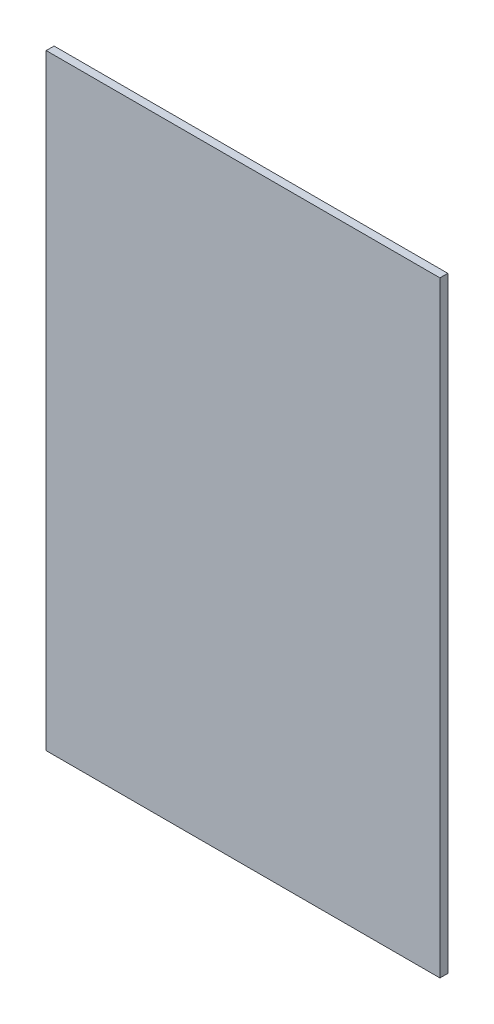
ISO-10303-21;
HEADER;
FILE_DESCRIPTION(('STEP AP214'),'2;1');
FILE_NAME('part.step','',(''),(''),'','','');
FILE_SCHEMA(('AUTOMOTIVE_DESIGN { 1 0 10303 214 1 1 1 1 }'));
ENDSEC;
DATA;
#1=APPLICATION_CONTEXT('core data for automotive mechanical design processes');
#2=APPLICATION_PROTOCOL_DEFINITION('international standard','automotive_design',2000,#1);
#3=PRODUCT_CONTEXT('',#1,'mechanical');
#4=PRODUCT('Part','Part','',(#3));
#5=PRODUCT_RELATED_PRODUCT_CATEGORY('part','',(#4));
#6=PRODUCT_DEFINITION_FORMATION('','',#4);
#7=PRODUCT_DEFINITION_CONTEXT('part definition',#1,'design');
#8=PRODUCT_DEFINITION('design','',#6,#7);
#9=PRODUCT_DEFINITION_SHAPE('','',#8);
#10=(LENGTH_UNIT() NAMED_UNIT(*) SI_UNIT(.MILLI.,.METRE.));
#11=(NAMED_UNIT(*) PLANE_ANGLE_UNIT() SI_UNIT($,.RADIAN.));
#12=(NAMED_UNIT(*) SI_UNIT($,.STERADIAN.) SOLID_ANGLE_UNIT());
#13=UNCERTAINTY_MEASURE_WITH_UNIT(LENGTH_MEASURE(1.E-05),#10,'distance_accuracy_value','');
#14=(GEOMETRIC_REPRESENTATION_CONTEXT(3) GLOBAL_UNCERTAINTY_ASSIGNED_CONTEXT((#13)) GLOBAL_UNIT_ASSIGNED_CONTEXT((#10,
#11,#12)) REPRESENTATION_CONTEXT('',''));
#15=CARTESIAN_POINT('',(0.,0.,0.));
#16=DIRECTION('',(0.,0.,1.));
#17=DIRECTION('',(1.,0.,0.));
#18=AXIS2_PLACEMENT_3D('',#15,#16,#17);
#19=CARTESIAN_POINT('',(0.,-139.,0.));
#20=DIRECTION('',(-1.,0.,0.));
#21=DIRECTION('',(0.,0.,1.));
#22=AXIS2_PLACEMENT_3D('',#19,#20,#21);
#23=PLANE('',#22);
#24=DIRECTION('',(0.,1.,0.));
#25=VECTOR('',#24,1.);
#26=CARTESIAN_POINT('',(0.,-139.,0.));
#27=LINE('',#26,#25);
#28=CARTESIAN_POINT('',(0.,-139.,0.));
#29=VERTEX_POINT('',#28);
#30=CARTESIAN_POINT('',(0.,14.9999999999999,0.));
#31=VERTEX_POINT('',#30);
#32=EDGE_CURVE('E36',#29,#31,#27,.T.);
#33=ORIENTED_EDGE('',*,*,#32,.T.);
#34=DIRECTION('',(0.,0.,1.));
#35=VECTOR('',#34,1.);
#36=CARTESIAN_POINT('',(0.,14.9999999999999,0.));
#37=LINE('',#36,#35);
#38=CARTESIAN_POINT('',(0.,14.9999999999999,-2.));
#39=VERTEX_POINT('',#38);
#40=EDGE_CURVE('E73',#39,#31,#37,.T.);
#41=ORIENTED_EDGE('',*,*,#40,.F.);
#42=DIRECTION('',(0.,1.,0.));
#43=VECTOR('',#42,1.);
#44=CARTESIAN_POINT('',(0.,-139.,-2.));
#45=LINE('',#44,#43);
#46=CARTESIAN_POINT('',(0.,-139.,-2.));
#47=VERTEX_POINT('',#46);
#48=EDGE_CURVE('E11',#47,#39,#45,.T.);
#49=ORIENTED_EDGE('',*,*,#48,.F.);
#50=DIRECTION('',(0.,0.,1.));
#51=VECTOR('',#50,1.);
#52=CARTESIAN_POINT('',(0.,-139.,0.));
#53=LINE('',#52,#51);
#54=EDGE_CURVE('E74',#47,#29,#53,.T.);
#55=ORIENTED_EDGE('',*,*,#54,.T.);
#56=EDGE_LOOP('',(#33,#41,#49,#55));
#57=FACE_BOUND('',#56,.T.);
#58=ADVANCED_FACE('F33',(#57),#23,.T.);
#59=CARTESIAN_POINT('',(0.,-139.,-2.));
#60=DIRECTION('',(0.,0.,-1.));
#61=DIRECTION('',(-1.,0.,0.));
#62=AXIS2_PLACEMENT_3D('',#59,#60,#61);
#63=PLANE('',#62);
#64=ORIENTED_EDGE('',*,*,#48,.T.);
#65=DIRECTION('',(-1.,0.,0.));
#66=VECTOR('',#65,1.);
#67=CARTESIAN_POINT('',(0.,14.9999999999999,-2.));
#68=LINE('',#67,#66);
#69=CARTESIAN_POINT('',(100.,14.9999999999999,-2.));
#70=VERTEX_POINT('',#69);
#71=EDGE_CURVE('E90',#70,#39,#68,.T.);
#72=ORIENTED_EDGE('',*,*,#71,.F.);
#73=DIRECTION('',(0.,1.,0.));
#74=VECTOR('',#73,1.);
#75=CARTESIAN_POINT('',(100.,-139.,-2.));
#76=LINE('',#75,#74);
#77=CARTESIAN_POINT('',(100.,-139.,-2.));
#78=VERTEX_POINT('',#77);
#79=EDGE_CURVE('E41',#78,#70,#76,.T.);
#80=ORIENTED_EDGE('',*,*,#79,.F.);
#81=DIRECTION('',(-1.,0.,0.));
#82=VECTOR('',#81,1.);
#83=CARTESIAN_POINT('',(0.,-139.,-2.));
#84=LINE('',#83,#82);
#85=EDGE_CURVE('E79',#78,#47,#84,.T.);
#86=ORIENTED_EDGE('',*,*,#85,.T.);
#87=EDGE_LOOP('',(#64,#72,#80,#86));
#88=FACE_BOUND('',#87,.T.);
#89=ADVANCED_FACE('F105',(#88),#63,.T.);
#90=CARTESIAN_POINT('',(100.,-139.,0.));
#91=DIRECTION('',(1.,0.,0.));
#92=DIRECTION('',(0.,0.,-1.));
#93=AXIS2_PLACEMENT_3D('',#90,#91,#92);
#94=PLANE('',#93);
#95=ORIENTED_EDGE('',*,*,#79,.T.);
#96=DIRECTION('',(0.,0.,-1.));
#97=VECTOR('',#96,1.);
#98=CARTESIAN_POINT('',(100.,14.9999999999999,0.));
#99=LINE('',#98,#97);
#100=CARTESIAN_POINT('',(100.,14.9999999999999,0.));
#101=VERTEX_POINT('',#100);
#102=EDGE_CURVE('E86',#101,#70,#99,.T.);
#103=ORIENTED_EDGE('',*,*,#102,.F.);
#104=DIRECTION('',(0.,1.,0.));
#105=VECTOR('',#104,1.);
#106=CARTESIAN_POINT('',(100.,-139.,0.));
#107=LINE('',#106,#105);
#108=CARTESIAN_POINT('',(100.,-139.,0.));
#109=VERTEX_POINT('',#108);
#110=EDGE_CURVE('E78',#109,#101,#107,.T.);
#111=ORIENTED_EDGE('',*,*,#110,.F.);
#112=DIRECTION('',(0.,0.,-1.));
#113=VECTOR('',#112,1.);
#114=CARTESIAN_POINT('',(100.,-139.,0.));
#115=LINE('',#114,#113);
#116=EDGE_CURVE('E98',#109,#78,#115,.T.);
#117=ORIENTED_EDGE('',*,*,#116,.T.);
#118=EDGE_LOOP('',(#95,#103,#111,#117));
#119=FACE_BOUND('',#118,.T.);
#120=ADVANCED_FACE('F102',(#119),#94,.T.);
#121=CARTESIAN_POINT('',(0.,-139.,0.));
#122=DIRECTION('',(0.,0.,1.));
#123=DIRECTION('',(1.,0.,0.));
#124=AXIS2_PLACEMENT_3D('',#121,#122,#123);
#125=PLANE('',#124);
#126=ORIENTED_EDGE('',*,*,#110,.T.);
#127=DIRECTION('',(1.,0.,0.));
#128=VECTOR('',#127,1.);
#129=CARTESIAN_POINT('',(0.,14.9999999999999,0.));
#130=LINE('',#129,#128);
#131=EDGE_CURVE('E81',#31,#101,#130,.T.);
#132=ORIENTED_EDGE('',*,*,#131,.F.);
#133=ORIENTED_EDGE('',*,*,#32,.F.);
#134=DIRECTION('',(1.,0.,0.));
#135=VECTOR('',#134,1.);
#136=CARTESIAN_POINT('',(0.,-139.,0.));
#137=LINE('',#136,#135);
#138=EDGE_CURVE('E96',#29,#109,#137,.T.);
#139=ORIENTED_EDGE('',*,*,#138,.T.);
#140=EDGE_LOOP('',(#126,#132,#133,#139));
#141=FACE_BOUND('',#140,.T.);
#142=ADVANCED_FACE('F82',(#141),#125,.T.);
#143=CARTESIAN_POINT('',(0.,-139.,0.));
#144=DIRECTION('',(0.,-1.,0.));
#145=DIRECTION('',(0.,0.,-1.));
#146=AXIS2_PLACEMENT_3D('',#143,#144,#145);
#147=PLANE('',#146);
#148=ORIENTED_EDGE('',*,*,#54,.F.);
#149=ORIENTED_EDGE('',*,*,#85,.F.);
#150=ORIENTED_EDGE('',*,*,#116,.F.);
#151=ORIENTED_EDGE('',*,*,#138,.F.);
#152=EDGE_LOOP('',(#148,#149,#150,#151));
#153=FACE_BOUND('',#152,.T.);
#154=ADVANCED_FACE('F107',(#153),#147,.T.);
#155=CARTESIAN_POINT('',(0.,14.9999999999999,0.));
#156=DIRECTION('',(0.,-1.,0.));
#157=DIRECTION('',(0.,0.,-1.));
#158=AXIS2_PLACEMENT_3D('',#155,#156,#157);
#159=PLANE('',#158);
#160=ORIENTED_EDGE('',*,*,#40,.T.);
#161=ORIENTED_EDGE('',*,*,#131,.T.);
#162=ORIENTED_EDGE('',*,*,#102,.T.);
#163=ORIENTED_EDGE('',*,*,#71,.T.);
#164=EDGE_LOOP('',(#160,#161,#162,#163));
#165=FACE_BOUND('',#164,.T.);
#166=ADVANCED_FACE('F89',(#165),#159,.F.);
#167=CLOSED_SHELL('',(#58,#89,#120,#142,#154,#166));
#168=MANIFOLD_SOLID_BREP('B2',#167);
#169=ADVANCED_BREP_SHAPE_REPRESENTATION('',(#18,#168),#14);
#170=SHAPE_DEFINITION_REPRESENTATION(#9,#169);
ENDSEC;
END-ISO-10303-21;
